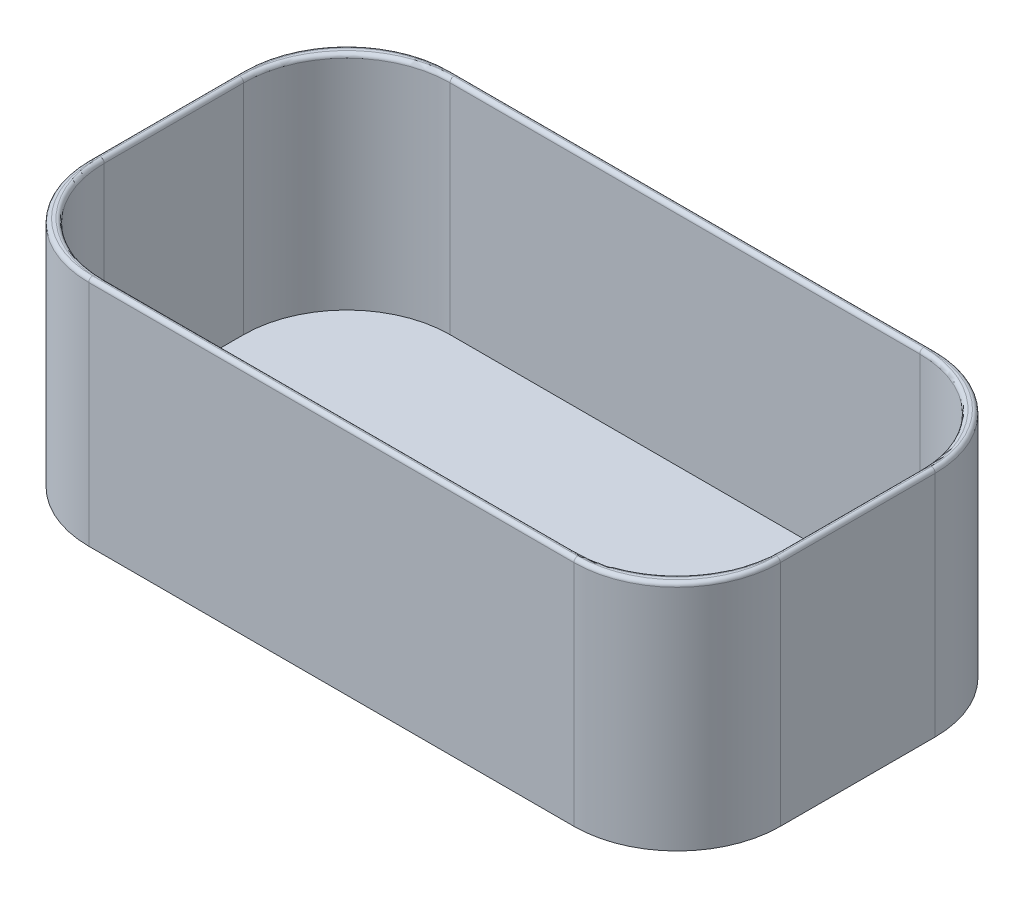
ISO-10303-21;
HEADER;
FILE_DESCRIPTION(('STEP AP214'),'2;1');
FILE_NAME('part.step','',(''),(''),'','','');
FILE_SCHEMA(('AUTOMOTIVE_DESIGN { 1 0 10303 214 1 1 1 1 }'));
ENDSEC;
DATA;
#1=APPLICATION_CONTEXT('core data for automotive mechanical design processes');
#2=APPLICATION_PROTOCOL_DEFINITION('international standard','automotive_design',2000,#1);
#3=PRODUCT_CONTEXT('',#1,'mechanical');
#4=PRODUCT('Part','Part','',(#3));
#5=PRODUCT_RELATED_PRODUCT_CATEGORY('part','',(#4));
#6=PRODUCT_DEFINITION_FORMATION('','',#4);
#7=PRODUCT_DEFINITION_CONTEXT('part definition',#1,'design');
#8=PRODUCT_DEFINITION('design','',#6,#7);
#9=PRODUCT_DEFINITION_SHAPE('','',#8);
#10=(LENGTH_UNIT() NAMED_UNIT(*) SI_UNIT(.MILLI.,.METRE.));
#11=(NAMED_UNIT(*) PLANE_ANGLE_UNIT() SI_UNIT($,.RADIAN.));
#12=(NAMED_UNIT(*) SI_UNIT($,.STERADIAN.) SOLID_ANGLE_UNIT());
#13=UNCERTAINTY_MEASURE_WITH_UNIT(LENGTH_MEASURE(1.E-05),#10,'distance_accuracy_value','');
#14=(GEOMETRIC_REPRESENTATION_CONTEXT(3) GLOBAL_UNCERTAINTY_ASSIGNED_CONTEXT((#13)) GLOBAL_UNIT_ASSIGNED_CONTEXT((#10,
#11,#12)) REPRESENTATION_CONTEXT('',''));
#15=CARTESIAN_POINT('',(0.,0.,0.));
#16=DIRECTION('',(0.,0.,1.));
#17=DIRECTION('',(1.,0.,0.));
#18=AXIS2_PLACEMENT_3D('',#15,#16,#17);
#19=CARTESIAN_POINT('',(0.,45.,0.));
#20=DIRECTION('',(0.,-1.,0.));
#21=DIRECTION('',(0.,0.,-1.));
#22=AXIS2_PLACEMENT_3D('',#19,#20,#21);
#23=PLANE('',#22);
#24=CARTESIAN_POINT('',(47.,45.,15.));
#25=DIRECTION('',(0.,-1.,0.));
#26=DIRECTION('',(0.,0.,-1.));
#27=AXIS2_PLACEMENT_3D('',#24,#25,#26);
#28=CIRCLE('',#27,19.25);
#29=CARTESIAN_POINT('',(47.,45.,34.25));
#30=VERTEX_POINT('',#29);
#31=CARTESIAN_POINT('',(66.25,45.,15.));
#32=VERTEX_POINT('',#31);
#33=EDGE_CURVE('E302',#30,#32,#28,.F.);
#34=ORIENTED_EDGE('',*,*,#33,.T.);
#35=DIRECTION('',(0.,0.,-1.));
#36=VECTOR('',#35,1.);
#37=CARTESIAN_POINT('',(66.25,45.,0.));
#38=LINE('',#37,#36);
#39=CARTESIAN_POINT('',(66.25,45.,13.5));
#40=VERTEX_POINT('',#39);
#41=EDGE_CURVE('E304',#32,#40,#38,.T.);
#42=ORIENTED_EDGE('',*,*,#41,.T.);
#43=CARTESIAN_POINT('',(45.5,45.,13.5));
#44=DIRECTION('',(0.,-1.,0.));
#45=DIRECTION('',(0.,0.,-1.));
#46=AXIS2_PLACEMENT_3D('',#43,#44,#45);
#47=CIRCLE('',#46,20.75);
#48=CARTESIAN_POINT('',(45.5,45.,34.25));
#49=VERTEX_POINT('',#48);
#50=EDGE_CURVE('E298',#40,#49,#47,.T.);
#51=ORIENTED_EDGE('',*,*,#50,.T.);
#52=DIRECTION('',(1.,0.,0.));
#53=VECTOR('',#52,1.);
#54=CARTESIAN_POINT('',(0.,45.,34.25));
#55=LINE('',#54,#53);
#56=EDGE_CURVE('E300',#49,#30,#55,.T.);
#57=ORIENTED_EDGE('',*,*,#56,.T.);
#58=EDGE_LOOP('',(#34,#42,#51,#57));
#59=FACE_BOUND('',#58,.T.);
#60=ADVANCED_FACE('F37',(#59),#23,.F.);
#61=CARTESIAN_POINT('',(47.,45.,-15.));
#62=DIRECTION('',(0.,-1.,0.));
#63=DIRECTION('',(0.,0.,-1.));
#64=AXIS2_PLACEMENT_3D('',#61,#62,#63);
#65=CIRCLE('',#64,19.25);
#66=CARTESIAN_POINT('',(66.25,45.,-15.));
#67=VERTEX_POINT('',#66);
#68=CARTESIAN_POINT('',(47.,45.,-34.25));
#69=VERTEX_POINT('',#68);
#70=EDGE_CURVE('E293',#67,#69,#65,.F.);
#71=ORIENTED_EDGE('',*,*,#70,.T.);
#72=DIRECTION('',(1.,0.,0.));
#73=VECTOR('',#72,1.);
#74=CARTESIAN_POINT('',(-47.,45.,-34.25));
#75=LINE('',#74,#73);
#76=CARTESIAN_POINT('',(45.5,45.,-34.25));
#77=VERTEX_POINT('',#76);
#78=EDGE_CURVE('E295',#69,#77,#75,.F.);
#79=ORIENTED_EDGE('',*,*,#78,.T.);
#80=CARTESIAN_POINT('',(45.5,45.,-13.5));
#81=DIRECTION('',(0.,-1.,0.));
#82=DIRECTION('',(0.,0.,-1.));
#83=AXIS2_PLACEMENT_3D('',#80,#81,#82);
#84=CIRCLE('',#83,20.75);
#85=CARTESIAN_POINT('',(66.25,45.,-13.5));
#86=VERTEX_POINT('',#85);
#87=EDGE_CURVE('E289',#77,#86,#84,.T.);
#88=ORIENTED_EDGE('',*,*,#87,.T.);
#89=DIRECTION('',(0.,0.,-1.));
#90=VECTOR('',#89,1.);
#91=CARTESIAN_POINT('',(66.25,45.,0.));
#92=LINE('',#91,#90);
#93=EDGE_CURVE('E291',#86,#67,#92,.T.);
#94=ORIENTED_EDGE('',*,*,#93,.T.);
#95=EDGE_LOOP('',(#71,#79,#88,#94));
#96=FACE_BOUND('',#95,.T.);
#97=ADVANCED_FACE('F481',(#96),#23,.F.);
#98=DIRECTION('',(1.,0.,0.));
#99=VECTOR('',#98,1.);
#100=CARTESIAN_POINT('',(-47.,45.,-34.25));
#101=LINE('',#100,#99);
#102=CARTESIAN_POINT('',(-45.5,45.,-34.25));
#103=VERTEX_POINT('',#102);
#104=CARTESIAN_POINT('',(-47.,45.,-34.25));
#105=VERTEX_POINT('',#104);
#106=EDGE_CURVE('E284',#103,#105,#101,.F.);
#107=ORIENTED_EDGE('',*,*,#106,.T.);
#108=CARTESIAN_POINT('',(-47.,45.,-15.));
#109=DIRECTION('',(0.,-1.,0.));
#110=DIRECTION('',(0.,0.,-1.));
#111=AXIS2_PLACEMENT_3D('',#108,#109,#110);
#112=CIRCLE('',#111,19.25);
#113=CARTESIAN_POINT('',(-66.25,45.,-15.));
#114=VERTEX_POINT('',#113);
#115=EDGE_CURVE('E286',#105,#114,#112,.F.);
#116=ORIENTED_EDGE('',*,*,#115,.T.);
#117=DIRECTION('',(0.,0.,-1.));
#118=VECTOR('',#117,1.);
#119=CARTESIAN_POINT('',(-66.25,45.,15.));
#120=LINE('',#119,#118);
#121=CARTESIAN_POINT('',(-66.25,45.,-13.5));
#122=VERTEX_POINT('',#121);
#123=EDGE_CURVE('E282',#114,#122,#120,.F.);
#124=ORIENTED_EDGE('',*,*,#123,.T.);
#125=CARTESIAN_POINT('',(-45.5,45.,-13.5));
#126=DIRECTION('',(0.,-1.,0.));
#127=DIRECTION('',(0.,0.,-1.));
#128=AXIS2_PLACEMENT_3D('',#125,#126,#127);
#129=CIRCLE('',#128,20.75);
#130=EDGE_CURVE('E280',#122,#103,#129,.T.);
#131=ORIENTED_EDGE('',*,*,#130,.T.);
#132=EDGE_LOOP('',(#107,#116,#124,#131));
#133=FACE_BOUND('',#132,.T.);
#134=ADVANCED_FACE('F486',(#133),#23,.F.);
#135=CARTESIAN_POINT('',(-67.,45.,35.));
#136=DIRECTION('',(-1.,0.,0.));
#137=DIRECTION('',(0.,0.,1.));
#138=AXIS2_PLACEMENT_3D('',#135,#136,#137);
#139=PLANE('',#138);
#140=DIRECTION('',(0.,-1.,0.));
#141=VECTOR('',#140,1.);
#142=CARTESIAN_POINT('',(-67.,45.,15.));
#143=LINE('',#142,#141);
#144=CARTESIAN_POINT('',(-67.,0.,15.));
#145=VERTEX_POINT('',#144);
#146=CARTESIAN_POINT('',(-67.,44.25,15.));
#147=VERTEX_POINT('',#146);
#148=EDGE_CURVE('E248',#145,#147,#143,.F.);
#149=ORIENTED_EDGE('',*,*,#148,.T.);
#150=DIRECTION('',(0.,0.,-1.));
#151=VECTOR('',#150,1.);
#152=CARTESIAN_POINT('',(-67.,44.25,-15.));
#153=LINE('',#152,#151);
#154=CARTESIAN_POINT('',(-67.,44.25,-15.));
#155=VERTEX_POINT('',#154);
#156=EDGE_CURVE('E322',#147,#155,#153,.T.);
#157=ORIENTED_EDGE('',*,*,#156,.T.);
#158=DIRECTION('',(0.,-1.,0.));
#159=VECTOR('',#158,1.);
#160=CARTESIAN_POINT('',(-67.,45.,-15.));
#161=LINE('',#160,#159);
#162=CARTESIAN_POINT('',(-67.,0.,-15.));
#163=VERTEX_POINT('',#162);
#164=EDGE_CURVE('E246',#155,#163,#161,.T.);
#165=ORIENTED_EDGE('',*,*,#164,.T.);
#166=DIRECTION('',(0.,0.,-1.));
#167=VECTOR('',#166,1.);
#168=CARTESIAN_POINT('',(-67.,0.,35.));
#169=LINE('',#168,#167);
#170=EDGE_CURVE('E401',#145,#163,#169,.T.);
#171=ORIENTED_EDGE('',*,*,#170,.F.);
#172=EDGE_LOOP('',(#149,#157,#165,#171));
#173=FACE_BOUND('',#172,.T.);
#174=ADVANCED_FACE('F450',(#173),#139,.T.);
#175=CARTESIAN_POINT('',(-67.,45.,35.));
#176=DIRECTION('',(0.,0.,-1.));
#177=DIRECTION('',(-1.,0.,0.));
#178=AXIS2_PLACEMENT_3D('',#175,#176,#177);
#179=PLANE('',#178);
#180=DIRECTION('',(0.,-1.,0.));
#181=VECTOR('',#180,1.);
#182=CARTESIAN_POINT('',(47.,45.,35.));
#183=LINE('',#182,#181);
#184=CARTESIAN_POINT('',(47.,0.,35.));
#185=VERTEX_POINT('',#184);
#186=CARTESIAN_POINT('',(47.,44.25,35.));
#187=VERTEX_POINT('',#186);
#188=EDGE_CURVE('E208',#185,#187,#183,.F.);
#189=ORIENTED_EDGE('',*,*,#188,.T.);
#190=DIRECTION('',(1.,0.,0.));
#191=VECTOR('',#190,1.);
#192=CARTESIAN_POINT('',(-67.,44.25,35.));
#193=LINE('',#192,#191);
#194=CARTESIAN_POINT('',(-47.,44.25,35.));
#195=VERTEX_POINT('',#194);
#196=EDGE_CURVE('E318',#187,#195,#193,.F.);
#197=ORIENTED_EDGE('',*,*,#196,.T.);
#198=DIRECTION('',(0.,-1.,0.));
#199=VECTOR('',#198,1.);
#200=CARTESIAN_POINT('',(-47.,0.,35.));
#201=LINE('',#200,#199);
#202=CARTESIAN_POINT('',(-47.,0.,35.));
#203=VERTEX_POINT('',#202);
#204=EDGE_CURVE('E236',#195,#203,#201,.T.);
#205=ORIENTED_EDGE('',*,*,#204,.T.);
#206=DIRECTION('',(1.,0.,0.));
#207=VECTOR('',#206,1.);
#208=CARTESIAN_POINT('',(-67.,0.,35.));
#209=LINE('',#208,#207);
#210=EDGE_CURVE('E224',#203,#185,#209,.T.);
#211=ORIENTED_EDGE('',*,*,#210,.T.);
#212=EDGE_LOOP('',(#189,#197,#205,#211));
#213=FACE_BOUND('',#212,.T.);
#214=ADVANCED_FACE('F415',(#213),#179,.F.);
#215=CARTESIAN_POINT('',(67.,45.,35.));
#216=DIRECTION('',(-1.,0.,0.));
#217=DIRECTION('',(0.,0.,1.));
#218=AXIS2_PLACEMENT_3D('',#215,#216,#217);
#219=PLANE('',#218);
#220=DIRECTION('',(0.,-1.,0.));
#221=VECTOR('',#220,1.);
#222=CARTESIAN_POINT('',(67.,45.,-15.));
#223=LINE('',#222,#221);
#224=CARTESIAN_POINT('',(67.,0.,-15.));
#225=VERTEX_POINT('',#224);
#226=CARTESIAN_POINT('',(67.,44.25,-15.));
#227=VERTEX_POINT('',#226);
#228=EDGE_CURVE('E266',#225,#227,#223,.F.);
#229=ORIENTED_EDGE('',*,*,#228,.T.);
#230=DIRECTION('',(0.,0.,-1.));
#231=VECTOR('',#230,1.);
#232=CARTESIAN_POINT('',(67.,44.25,35.));
#233=LINE('',#232,#231);
#234=CARTESIAN_POINT('',(67.,44.25,15.));
#235=VERTEX_POINT('',#234);
#236=EDGE_CURVE('E314',#227,#235,#233,.F.);
#237=ORIENTED_EDGE('',*,*,#236,.T.);
#238=DIRECTION('',(0.,-1.,0.));
#239=VECTOR('',#238,1.);
#240=CARTESIAN_POINT('',(67.,45.,15.));
#241=LINE('',#240,#239);
#242=CARTESIAN_POINT('',(67.,0.,15.));
#243=VERTEX_POINT('',#242);
#244=EDGE_CURVE('E269',#235,#243,#241,.T.);
#245=ORIENTED_EDGE('',*,*,#244,.T.);
#246=DIRECTION('',(0.,0.,-1.));
#247=VECTOR('',#246,1.);
#248=CARTESIAN_POINT('',(67.,0.,35.));
#249=LINE('',#248,#247);
#250=EDGE_CURVE('E409',#243,#225,#249,.T.);
#251=ORIENTED_EDGE('',*,*,#250,.T.);
#252=EDGE_LOOP('',(#229,#237,#245,#251));
#253=FACE_BOUND('',#252,.T.);
#254=ADVANCED_FACE('F470',(#253),#219,.F.);
#255=CARTESIAN_POINT('',(-67.,45.,-35.));
#256=DIRECTION('',(0.,0.,-1.));
#257=DIRECTION('',(-1.,0.,0.));
#258=AXIS2_PLACEMENT_3D('',#255,#256,#257);
#259=PLANE('',#258);
#260=DIRECTION('',(0.,-1.,0.));
#261=VECTOR('',#260,1.);
#262=CARTESIAN_POINT('',(-47.,45.,-35.));
#263=LINE('',#262,#261);
#264=CARTESIAN_POINT('',(-47.,0.,-35.));
#265=VERTEX_POINT('',#264);
#266=CARTESIAN_POINT('',(-47.,44.25,-35.));
#267=VERTEX_POINT('',#266);
#268=EDGE_CURVE('E253',#265,#267,#263,.F.);
#269=ORIENTED_EDGE('',*,*,#268,.T.);
#270=DIRECTION('',(1.,0.,0.));
#271=VECTOR('',#270,1.);
#272=CARTESIAN_POINT('',(47.,44.25,-35.));
#273=LINE('',#272,#271);
#274=CARTESIAN_POINT('',(47.,44.25,-35.));
#275=VERTEX_POINT('',#274);
#276=EDGE_CURVE('E310',#267,#275,#273,.T.);
#277=ORIENTED_EDGE('',*,*,#276,.T.);
#278=DIRECTION('',(0.,-1.,0.));
#279=VECTOR('',#278,1.);
#280=CARTESIAN_POINT('',(47.,0.,-35.));
#281=LINE('',#280,#279);
#282=CARTESIAN_POINT('',(47.,0.,-35.));
#283=VERTEX_POINT('',#282);
#284=EDGE_CURVE('E251',#275,#283,#281,.T.);
#285=ORIENTED_EDGE('',*,*,#284,.T.);
#286=DIRECTION('',(1.,0.,0.));
#287=VECTOR('',#286,1.);
#288=CARTESIAN_POINT('',(-67.,0.,-35.));
#289=LINE('',#288,#287);
#290=EDGE_CURVE('E406',#265,#283,#289,.T.);
#291=ORIENTED_EDGE('',*,*,#290,.F.);
#292=EDGE_LOOP('',(#269,#277,#285,#291));
#293=FACE_BOUND('',#292,.T.);
#294=ADVANCED_FACE('F461',(#293),#259,.T.);
#295=CARTESIAN_POINT('',(-47.,45.,15.));
#296=DIRECTION('',(0.,-1.,0.));
#297=DIRECTION('',(0.,0.,-1.));
#298=AXIS2_PLACEMENT_3D('',#295,#296,#297);
#299=CIRCLE('',#298,19.25);
#300=CARTESIAN_POINT('',(-66.25,45.,15.));
#301=VERTEX_POINT('',#300);
#302=CARTESIAN_POINT('',(-47.,45.,34.25));
#303=VERTEX_POINT('',#302);
#304=EDGE_CURVE('E275',#301,#303,#299,.F.);
#305=ORIENTED_EDGE('',*,*,#304,.T.);
#306=DIRECTION('',(1.,0.,0.));
#307=VECTOR('',#306,1.);
#308=CARTESIAN_POINT('',(0.,45.,34.25));
#309=LINE('',#308,#307);
#310=CARTESIAN_POINT('',(-45.5,45.,34.25));
#311=VERTEX_POINT('',#310);
#312=EDGE_CURVE('E277',#303,#311,#309,.T.);
#313=ORIENTED_EDGE('',*,*,#312,.T.);
#314=CARTESIAN_POINT('',(-45.5,45.,13.5));
#315=DIRECTION('',(0.,-1.,0.));
#316=DIRECTION('',(0.,0.,-1.));
#317=AXIS2_PLACEMENT_3D('',#314,#315,#316);
#318=CIRCLE('',#317,20.75);
#319=CARTESIAN_POINT('',(-66.25,45.,13.5));
#320=VERTEX_POINT('',#319);
#321=EDGE_CURVE('E271',#311,#320,#318,.T.);
#322=ORIENTED_EDGE('',*,*,#321,.T.);
#323=DIRECTION('',(0.,0.,-1.));
#324=VECTOR('',#323,1.);
#325=CARTESIAN_POINT('',(-66.25,45.,15.));
#326=LINE('',#325,#324);
#327=EDGE_CURVE('E273',#320,#301,#326,.F.);
#328=ORIENTED_EDGE('',*,*,#327,.T.);
#329=EDGE_LOOP('',(#305,#313,#322,#328));
#330=FACE_BOUND('',#329,.T.);
#331=ADVANCED_FACE('F477',(#330),#23,.F.);
#332=CARTESIAN_POINT('',(0.,0.,0.));
#333=DIRECTION('',(0.,-1.,0.));
#334=DIRECTION('',(0.,0.,-1.));
#335=AXIS2_PLACEMENT_3D('',#332,#333,#334);
#336=PLANE('',#335);
#337=ORIENTED_EDGE('',*,*,#210,.F.);
#338=CARTESIAN_POINT('',(-47.,0.,15.));
#339=DIRECTION('',(0.,-1.,0.));
#340=DIRECTION('',(0.,0.,-1.));
#341=AXIS2_PLACEMENT_3D('',#338,#339,#340);
#342=CIRCLE('',#341,20.);
#343=EDGE_CURVE('E244',#203,#145,#342,.T.);
#344=ORIENTED_EDGE('',*,*,#343,.T.);
#345=ORIENTED_EDGE('',*,*,#170,.T.);
#346=CARTESIAN_POINT('',(-47.,0.,-15.));
#347=DIRECTION('',(0.,-1.,0.));
#348=DIRECTION('',(0.,0.,-1.));
#349=AXIS2_PLACEMENT_3D('',#346,#347,#348);
#350=CIRCLE('',#349,20.);
#351=EDGE_CURVE('E242',#163,#265,#350,.T.);
#352=ORIENTED_EDGE('',*,*,#351,.T.);
#353=ORIENTED_EDGE('',*,*,#290,.T.);
#354=CARTESIAN_POINT('',(47.,0.,-15.));
#355=DIRECTION('',(0.,-1.,0.));
#356=DIRECTION('',(0.,0.,-1.));
#357=AXIS2_PLACEMENT_3D('',#354,#355,#356);
#358=CIRCLE('',#357,20.);
#359=EDGE_CURVE('E238',#283,#225,#358,.T.);
#360=ORIENTED_EDGE('',*,*,#359,.T.);
#361=ORIENTED_EDGE('',*,*,#250,.F.);
#362=CARTESIAN_POINT('',(47.,0.,15.));
#363=DIRECTION('',(0.,-1.,0.));
#364=DIRECTION('',(0.,0.,-1.));
#365=AXIS2_PLACEMENT_3D('',#362,#363,#364);
#366=CIRCLE('',#365,20.);
#367=EDGE_CURVE('E240',#243,#185,#366,.T.);
#368=ORIENTED_EDGE('',*,*,#367,.T.);
#369=EDGE_LOOP('',(#337,#344,#345,#352,#353,#360,#361,#368));
#370=FACE_BOUND('',#369,.T.);
#371=ADVANCED_FACE('F448',(#370),#336,.T.);
#372=CARTESIAN_POINT('',(0.,2.,0.));
#373=DIRECTION('',(0.,-1.,0.));
#374=DIRECTION('',(0.,0.,-1.));
#375=AXIS2_PLACEMENT_3D('',#372,#373,#374);
#376=PLANE('',#375);
#377=DIRECTION('',(0.,0.,1.));
#378=VECTOR('',#377,1.);
#379=CARTESIAN_POINT('',(-65.5,2.,-33.5));
#380=LINE('',#379,#378);
#381=CARTESIAN_POINT('',(-65.5,2.,-13.5));
#382=VERTEX_POINT('',#381);
#383=CARTESIAN_POINT('',(-65.5,2.,13.5));
#384=VERTEX_POINT('',#383);
#385=EDGE_CURVE('E207',#382,#384,#380,.T.);
#386=ORIENTED_EDGE('',*,*,#385,.T.);
#387=CARTESIAN_POINT('',(-45.5,2.,13.5));
#388=DIRECTION('',(0.,-1.,0.));
#389=DIRECTION('',(0.,0.,-1.));
#390=AXIS2_PLACEMENT_3D('',#387,#388,#389);
#391=CIRCLE('',#390,20.);
#392=CARTESIAN_POINT('',(-45.5,2.,33.5));
#393=VERTEX_POINT('',#392);
#394=EDGE_CURVE('E201',#384,#393,#391,.F.);
#395=ORIENTED_EDGE('',*,*,#394,.T.);
#396=DIRECTION('',(1.,0.,0.));
#397=VECTOR('',#396,1.);
#398=CARTESIAN_POINT('',(-65.5,2.,33.5));
#399=LINE('',#398,#397);
#400=CARTESIAN_POINT('',(45.5,2.,33.5));
#401=VERTEX_POINT('',#400);
#402=EDGE_CURVE('E204',#393,#401,#399,.T.);
#403=ORIENTED_EDGE('',*,*,#402,.T.);
#404=CARTESIAN_POINT('',(45.5,2.,13.5));
#405=DIRECTION('',(0.,-1.,0.));
#406=DIRECTION('',(0.,0.,-1.));
#407=AXIS2_PLACEMENT_3D('',#404,#405,#406);
#408=CIRCLE('',#407,20.);
#409=CARTESIAN_POINT('',(65.5,2.,13.5));
#410=VERTEX_POINT('',#409);
#411=EDGE_CURVE('E229',#401,#410,#408,.F.);
#412=ORIENTED_EDGE('',*,*,#411,.T.);
#413=DIRECTION('',(0.,0.,-1.));
#414=VECTOR('',#413,1.);
#415=CARTESIAN_POINT('',(65.5,2.,33.5));
#416=LINE('',#415,#414);
#417=CARTESIAN_POINT('',(65.5,2.,-13.5));
#418=VERTEX_POINT('',#417);
#419=EDGE_CURVE('E217',#410,#418,#416,.T.);
#420=ORIENTED_EDGE('',*,*,#419,.T.);
#421=CARTESIAN_POINT('',(45.5,2.,-13.5));
#422=DIRECTION('',(0.,-1.,0.));
#423=DIRECTION('',(0.,0.,-1.));
#424=AXIS2_PLACEMENT_3D('',#421,#422,#423);
#425=CIRCLE('',#424,20.);
#426=CARTESIAN_POINT('',(45.5,2.,-33.5));
#427=VERTEX_POINT('',#426);
#428=EDGE_CURVE('E231',#418,#427,#425,.F.);
#429=ORIENTED_EDGE('',*,*,#428,.T.);
#430=DIRECTION('',(-1.,0.,0.));
#431=VECTOR('',#430,1.);
#432=CARTESIAN_POINT('',(65.5,2.,-33.5));
#433=LINE('',#432,#431);
#434=CARTESIAN_POINT('',(-45.5,2.,-33.5));
#435=VERTEX_POINT('',#434);
#436=EDGE_CURVE('E398',#427,#435,#433,.T.);
#437=ORIENTED_EDGE('',*,*,#436,.T.);
#438=CARTESIAN_POINT('',(-45.5,2.,-13.5));
#439=DIRECTION('',(0.,-1.,0.));
#440=DIRECTION('',(0.,0.,-1.));
#441=AXIS2_PLACEMENT_3D('',#438,#439,#440);
#442=CIRCLE('',#441,20.);
#443=EDGE_CURVE('E209',#435,#382,#442,.F.);
#444=ORIENTED_EDGE('',*,*,#443,.T.);
#445=EDGE_LOOP('',(#386,#395,#403,#412,#420,#429,#437,#444));
#446=FACE_BOUND('',#445,.T.);
#447=ADVANCED_FACE('F203',(#446),#376,.F.);
#448=CARTESIAN_POINT('',(-65.5,-147.139389695622,-33.5));
#449=DIRECTION('',(-1.,0.,0.));
#450=DIRECTION('',(0.,0.,1.));
#451=AXIS2_PLACEMENT_3D('',#448,#449,#450);
#452=PLANE('',#451);
#453=DIRECTION('',(0.,1.,0.));
#454=VECTOR('',#453,1.);
#455=CARTESIAN_POINT('',(-65.5,45.,-13.5));
#456=LINE('',#455,#454);
#457=CARTESIAN_POINT('',(-65.5,44.25,-13.5));
#458=VERTEX_POINT('',#457);
#459=EDGE_CURVE('E220',#382,#458,#456,.T.);
#460=ORIENTED_EDGE('',*,*,#459,.T.);
#461=DIRECTION('',(0.,0.,1.));
#462=VECTOR('',#461,1.);
#463=CARTESIAN_POINT('',(-65.5,44.25,-33.5));
#464=LINE('',#463,#462);
#465=CARTESIAN_POINT('',(-65.5,44.25,13.5));
#466=VERTEX_POINT('',#465);
#467=EDGE_CURVE('E61',#458,#466,#464,.T.);
#468=ORIENTED_EDGE('',*,*,#467,.T.);
#469=DIRECTION('',(0.,1.,0.));
#470=VECTOR('',#469,1.);
#471=CARTESIAN_POINT('',(-65.5,1.99999999999995,13.5));
#472=LINE('',#471,#470);
#473=EDGE_CURVE('E222',#466,#384,#472,.F.);
#474=ORIENTED_EDGE('',*,*,#473,.T.);
#475=ORIENTED_EDGE('',*,*,#385,.F.);
#476=EDGE_LOOP('',(#460,#468,#474,#475));
#477=FACE_BOUND('',#476,.T.);
#478=ADVANCED_FACE('F598',(#477),#452,.F.);
#479=CARTESIAN_POINT('',(-65.5,-147.139389695622,33.5));
#480=DIRECTION('',(0.,0.,1.));
#481=DIRECTION('',(1.,0.,0.));
#482=AXIS2_PLACEMENT_3D('',#479,#480,#481);
#483=PLANE('',#482);
#484=DIRECTION('',(0.,1.,0.));
#485=VECTOR('',#484,1.);
#486=CARTESIAN_POINT('',(-45.5,45.,33.5));
#487=LINE('',#486,#485);
#488=CARTESIAN_POINT('',(-45.5,44.25,33.5));
#489=VERTEX_POINT('',#488);
#490=EDGE_CURVE('E213',#393,#489,#487,.T.);
#491=ORIENTED_EDGE('',*,*,#490,.T.);
#492=DIRECTION('',(1.,0.,0.));
#493=VECTOR('',#492,1.);
#494=CARTESIAN_POINT('',(-65.5,44.25,33.5));
#495=LINE('',#494,#493);
#496=CARTESIAN_POINT('',(45.5,44.25,33.5));
#497=VERTEX_POINT('',#496);
#498=EDGE_CURVE('E12',#489,#497,#495,.T.);
#499=ORIENTED_EDGE('',*,*,#498,.T.);
#500=DIRECTION('',(0.,1.,0.));
#501=VECTOR('',#500,1.);
#502=CARTESIAN_POINT('',(45.5,2.,33.5));
#503=LINE('',#502,#501);
#504=EDGE_CURVE('E216',#497,#401,#503,.F.);
#505=ORIENTED_EDGE('',*,*,#504,.T.);
#506=ORIENTED_EDGE('',*,*,#402,.F.);
#507=EDGE_LOOP('',(#491,#499,#505,#506));
#508=FACE_BOUND('',#507,.T.);
#509=ADVANCED_FACE('F212',(#508),#483,.F.);
#510=CARTESIAN_POINT('',(65.5,-147.139389695622,33.5));
#511=DIRECTION('',(1.,0.,0.));
#512=DIRECTION('',(0.,0.,-1.));
#513=AXIS2_PLACEMENT_3D('',#510,#511,#512);
#514=PLANE('',#513);
#515=DIRECTION('',(0.,1.,0.));
#516=VECTOR('',#515,1.);
#517=CARTESIAN_POINT('',(65.5,45.,13.5));
#518=LINE('',#517,#516);
#519=CARTESIAN_POINT('',(65.5,44.25,13.5));
#520=VERTEX_POINT('',#519);
#521=EDGE_CURVE('E261',#410,#520,#518,.T.);
#522=ORIENTED_EDGE('',*,*,#521,.T.);
#523=DIRECTION('',(0.,0.,-1.));
#524=VECTOR('',#523,1.);
#525=CARTESIAN_POINT('',(65.5,44.25,33.5));
#526=LINE('',#525,#524);
#527=CARTESIAN_POINT('',(65.5,44.25,-13.5));
#528=VERTEX_POINT('',#527);
#529=EDGE_CURVE('E327',#520,#528,#526,.T.);
#530=ORIENTED_EDGE('',*,*,#529,.T.);
#531=DIRECTION('',(0.,1.,0.));
#532=VECTOR('',#531,1.);
#533=CARTESIAN_POINT('',(65.5,2.,-13.5));
#534=LINE('',#533,#532);
#535=EDGE_CURVE('E264',#528,#418,#534,.F.);
#536=ORIENTED_EDGE('',*,*,#535,.T.);
#537=ORIENTED_EDGE('',*,*,#419,.F.);
#538=EDGE_LOOP('',(#522,#530,#536,#537));
#539=FACE_BOUND('',#538,.T.);
#540=ADVANCED_FACE('F579',(#539),#514,.F.);
#541=CARTESIAN_POINT('',(65.5,-147.139389695622,-33.5));
#542=DIRECTION('',(0.,0.,-1.));
#543=DIRECTION('',(-1.,0.,0.));
#544=AXIS2_PLACEMENT_3D('',#541,#542,#543);
#545=PLANE('',#544);
#546=DIRECTION('',(0.,1.,0.));
#547=VECTOR('',#546,1.);
#548=CARTESIAN_POINT('',(45.5,45.,-33.5));
#549=LINE('',#548,#547);
#550=CARTESIAN_POINT('',(45.5,44.25,-33.5));
#551=VERTEX_POINT('',#550);
#552=EDGE_CURVE('E256',#427,#551,#549,.T.);
#553=ORIENTED_EDGE('',*,*,#552,.T.);
#554=DIRECTION('',(-1.,0.,0.));
#555=VECTOR('',#554,1.);
#556=CARTESIAN_POINT('',(65.5,44.25,-33.5));
#557=LINE('',#556,#555);
#558=CARTESIAN_POINT('',(-45.5,44.25,-33.5));
#559=VERTEX_POINT('',#558);
#560=EDGE_CURVE('E331',#551,#559,#557,.T.);
#561=ORIENTED_EDGE('',*,*,#560,.T.);
#562=DIRECTION('',(0.,1.,0.));
#563=VECTOR('',#562,1.);
#564=CARTESIAN_POINT('',(-45.5,2.,-33.5));
#565=LINE('',#564,#563);
#566=EDGE_CURVE('E259',#559,#435,#565,.F.);
#567=ORIENTED_EDGE('',*,*,#566,.T.);
#568=ORIENTED_EDGE('',*,*,#436,.F.);
#569=EDGE_LOOP('',(#553,#561,#567,#568));
#570=FACE_BOUND('',#569,.T.);
#571=ADVANCED_FACE('F587',(#570),#545,.F.);
#572=CARTESIAN_POINT('',(-45.5,-147.139389695622,13.5));
#573=DIRECTION('',(0.,-1.,0.));
#574=DIRECTION('',(0.,0.,-1.));
#575=AXIS2_PLACEMENT_3D('',#572,#573,#574);
#576=CYLINDRICAL_SURFACE('',#575,20.);
#577=ORIENTED_EDGE('',*,*,#473,.F.);
#578=CARTESIAN_POINT('',(-45.5,44.25,13.5));
#579=DIRECTION('',(0.,-1.,0.));
#580=DIRECTION('',(0.,0.,-1.));
#581=AXIS2_PLACEMENT_3D('',#578,#579,#580);
#582=CIRCLE('',#581,20.);
#583=EDGE_CURVE('E46',#466,#489,#582,.F.);
#584=ORIENTED_EDGE('',*,*,#583,.T.);
#585=ORIENTED_EDGE('',*,*,#490,.F.);
#586=ORIENTED_EDGE('',*,*,#394,.F.);
#587=EDGE_LOOP('',(#577,#584,#585,#586));
#588=FACE_BOUND('',#587,.T.);
#589=ADVANCED_FACE('F219',(#588),#576,.F.);
#590=CARTESIAN_POINT('',(-47.,45.,15.));
#591=DIRECTION('',(0.,1.,0.));
#592=DIRECTION('',(0.,0.,1.));
#593=AXIS2_PLACEMENT_3D('',#590,#591,#592);
#594=CYLINDRICAL_SURFACE('',#593,20.);
#595=ORIENTED_EDGE('',*,*,#204,.F.);
#596=CARTESIAN_POINT('',(-47.,44.25,15.));
#597=DIRECTION('',(0.,-1.,0.));
#598=DIRECTION('',(0.,0.,-1.));
#599=AXIS2_PLACEMENT_3D('',#596,#597,#598);
#600=CIRCLE('',#599,20.);
#601=EDGE_CURVE('E320',#195,#147,#600,.T.);
#602=ORIENTED_EDGE('',*,*,#601,.T.);
#603=ORIENTED_EDGE('',*,*,#148,.F.);
#604=ORIENTED_EDGE('',*,*,#343,.F.);
#605=EDGE_LOOP('',(#595,#602,#603,#604));
#606=FACE_BOUND('',#605,.T.);
#607=ADVANCED_FACE('F445',(#606),#594,.T.);
#608=CARTESIAN_POINT('',(-47.,45.,-15.));
#609=DIRECTION('',(0.,-1.,0.));
#610=DIRECTION('',(0.,0.,-1.));
#611=AXIS2_PLACEMENT_3D('',#608,#609,#610);
#612=CYLINDRICAL_SURFACE('',#611,20.);
#613=ORIENTED_EDGE('',*,*,#164,.F.);
#614=CARTESIAN_POINT('',(-47.,44.25,-15.));
#615=DIRECTION('',(0.,-1.,0.));
#616=DIRECTION('',(0.,0.,-1.));
#617=AXIS2_PLACEMENT_3D('',#614,#615,#616);
#618=CIRCLE('',#617,20.);
#619=EDGE_CURVE('E307',#155,#267,#618,.T.);
#620=ORIENTED_EDGE('',*,*,#619,.T.);
#621=ORIENTED_EDGE('',*,*,#268,.F.);
#622=ORIENTED_EDGE('',*,*,#351,.F.);
#623=EDGE_LOOP('',(#613,#620,#621,#622));
#624=FACE_BOUND('',#623,.T.);
#625=ADVANCED_FACE('F458',(#624),#612,.T.);
#626=CARTESIAN_POINT('',(-45.5,-147.139389695622,-13.5));
#627=DIRECTION('',(0.,-1.,0.));
#628=DIRECTION('',(0.,0.,-1.));
#629=AXIS2_PLACEMENT_3D('',#626,#627,#628);
#630=CYLINDRICAL_SURFACE('',#629,20.);
#631=ORIENTED_EDGE('',*,*,#566,.F.);
#632=CARTESIAN_POINT('',(-45.5,44.25,-13.5));
#633=DIRECTION('',(0.,-1.,0.));
#634=DIRECTION('',(0.,0.,-1.));
#635=AXIS2_PLACEMENT_3D('',#632,#633,#634);
#636=CIRCLE('',#635,20.);
#637=EDGE_CURVE('E333',#559,#458,#636,.F.);
#638=ORIENTED_EDGE('',*,*,#637,.T.);
#639=ORIENTED_EDGE('',*,*,#459,.F.);
#640=ORIENTED_EDGE('',*,*,#443,.F.);
#641=EDGE_LOOP('',(#631,#638,#639,#640));
#642=FACE_BOUND('',#641,.T.);
#643=ADVANCED_FACE('F597',(#642),#630,.F.);
#644=CARTESIAN_POINT('',(45.5,-147.139389695622,-13.5));
#645=DIRECTION('',(0.,-1.,0.));
#646=DIRECTION('',(0.,0.,-1.));
#647=AXIS2_PLACEMENT_3D('',#644,#645,#646);
#648=CYLINDRICAL_SURFACE('',#647,20.);
#649=ORIENTED_EDGE('',*,*,#535,.F.);
#650=CARTESIAN_POINT('',(45.5,44.25,-13.5));
#651=DIRECTION('',(0.,-1.,0.));
#652=DIRECTION('',(0.,0.,-1.));
#653=AXIS2_PLACEMENT_3D('',#650,#651,#652);
#654=CIRCLE('',#653,20.);
#655=EDGE_CURVE('E329',#528,#551,#654,.F.);
#656=ORIENTED_EDGE('',*,*,#655,.T.);
#657=ORIENTED_EDGE('',*,*,#552,.F.);
#658=ORIENTED_EDGE('',*,*,#428,.F.);
#659=EDGE_LOOP('',(#649,#656,#657,#658));
#660=FACE_BOUND('',#659,.T.);
#661=ADVANCED_FACE('F584',(#660),#648,.F.);
#662=CARTESIAN_POINT('',(45.5,-147.139389695622,13.5));
#663=DIRECTION('',(0.,-1.,0.));
#664=DIRECTION('',(0.,0.,-1.));
#665=AXIS2_PLACEMENT_3D('',#662,#663,#664);
#666=CYLINDRICAL_SURFACE('',#665,20.);
#667=ORIENTED_EDGE('',*,*,#504,.F.);
#668=CARTESIAN_POINT('',(45.5,44.25,13.5));
#669=DIRECTION('',(0.,-1.,0.));
#670=DIRECTION('',(0.,0.,-1.));
#671=AXIS2_PLACEMENT_3D('',#668,#669,#670);
#672=CIRCLE('',#671,20.);
#673=EDGE_CURVE('E324',#497,#520,#672,.F.);
#674=ORIENTED_EDGE('',*,*,#673,.T.);
#675=ORIENTED_EDGE('',*,*,#521,.F.);
#676=ORIENTED_EDGE('',*,*,#411,.F.);
#677=EDGE_LOOP('',(#667,#674,#675,#676));
#678=FACE_BOUND('',#677,.T.);
#679=ADVANCED_FACE('F577',(#678),#666,.F.);
#680=CARTESIAN_POINT('',(47.,45.,15.));
#681=DIRECTION('',(0.,-1.,0.));
#682=DIRECTION('',(0.,0.,-1.));
#683=AXIS2_PLACEMENT_3D('',#680,#681,#682);
#684=CYLINDRICAL_SURFACE('',#683,20.);
#685=ORIENTED_EDGE('',*,*,#244,.F.);
#686=CARTESIAN_POINT('',(47.,44.25,15.));
#687=DIRECTION('',(0.,-1.,0.));
#688=DIRECTION('',(0.,0.,-1.));
#689=AXIS2_PLACEMENT_3D('',#686,#687,#688);
#690=CIRCLE('',#689,20.);
#691=EDGE_CURVE('E316',#235,#187,#690,.T.);
#692=ORIENTED_EDGE('',*,*,#691,.T.);
#693=ORIENTED_EDGE('',*,*,#188,.F.);
#694=ORIENTED_EDGE('',*,*,#367,.F.);
#695=EDGE_LOOP('',(#685,#692,#693,#694));
#696=FACE_BOUND('',#695,.T.);
#697=ADVANCED_FACE('F423',(#696),#684,.T.);
#698=CARTESIAN_POINT('',(47.,45.,-15.));
#699=DIRECTION('',(0.,1.,0.));
#700=DIRECTION('',(0.,0.,1.));
#701=AXIS2_PLACEMENT_3D('',#698,#699,#700);
#702=CYLINDRICAL_SURFACE('',#701,20.);
#703=ORIENTED_EDGE('',*,*,#284,.F.);
#704=CARTESIAN_POINT('',(47.,44.25,-15.));
#705=DIRECTION('',(0.,-1.,0.));
#706=DIRECTION('',(0.,0.,-1.));
#707=AXIS2_PLACEMENT_3D('',#704,#705,#706);
#708=CIRCLE('',#707,20.);
#709=EDGE_CURVE('E312',#275,#227,#708,.T.);
#710=ORIENTED_EDGE('',*,*,#709,.T.);
#711=ORIENTED_EDGE('',*,*,#228,.F.);
#712=ORIENTED_EDGE('',*,*,#359,.F.);
#713=EDGE_LOOP('',(#703,#710,#711,#712));
#714=FACE_BOUND('',#713,.T.);
#715=ADVANCED_FACE('F468',(#714),#702,.T.);
#716=CARTESIAN_POINT('',(45.5,44.25,13.5));
#717=DIRECTION('',(0.,-1.,0.));
#718=DIRECTION('',(0.,0.,-1.));
#719=AXIS2_PLACEMENT_3D('',#716,#717,#718);
#720=TOROIDAL_SURFACE('',#719,20.75,0.75);
#721=CARTESIAN_POINT('',(66.25,44.25,13.5));
#722=DIRECTION('',(0.,0.,-1.));
#723=DIRECTION('',(-1.,0.,0.));
#724=AXIS2_PLACEMENT_3D('',#721,#722,#723);
#725=CIRCLE('',#724,0.75);
#726=EDGE_CURVE('E41',#520,#40,#725,.T.);
#727=ORIENTED_EDGE('',*,*,#726,.F.);
#728=ORIENTED_EDGE('',*,*,#673,.F.);
#729=CARTESIAN_POINT('',(45.5,44.25,34.25));
#730=DIRECTION('',(-1.,0.,0.));
#731=DIRECTION('',(0.,0.,1.));
#732=AXIS2_PLACEMENT_3D('',#729,#730,#731);
#733=CIRCLE('',#732,0.75);
#734=EDGE_CURVE('E386',#49,#497,#733,.T.);
#735=ORIENTED_EDGE('',*,*,#734,.F.);
#736=ORIENTED_EDGE('',*,*,#50,.F.);
#737=EDGE_LOOP('',(#727,#728,#735,#736));
#738=FACE_BOUND('',#737,.T.);
#739=ADVANCED_FACE('F39',(#738),#720,.T.);
#740=CARTESIAN_POINT('',(66.25,44.25,33.5));
#741=DIRECTION('',(0.,0.,-1.));
#742=DIRECTION('',(-1.,0.,0.));
#743=AXIS2_PLACEMENT_3D('',#740,#741,#742);
#744=CYLINDRICAL_SURFACE('',#743,0.75);
#745=ORIENTED_EDGE('',*,*,#529,.F.);
#746=ORIENTED_EDGE('',*,*,#726,.T.);
#747=DIRECTION('',(0.,0.,-1.));
#748=VECTOR('',#747,1.);
#749=CARTESIAN_POINT('',(66.25,45.,0.));
#750=LINE('',#749,#748);
#751=EDGE_CURVE('E382',#86,#40,#750,.F.);
#752=ORIENTED_EDGE('',*,*,#751,.F.);
#753=CARTESIAN_POINT('',(66.25,44.25,-13.5));
#754=DIRECTION('',(0.,0.,-1.));
#755=DIRECTION('',(-1.,0.,0.));
#756=AXIS2_PLACEMENT_3D('',#753,#754,#755);
#757=CIRCLE('',#756,0.75);
#758=EDGE_CURVE('E379',#528,#86,#757,.T.);
#759=ORIENTED_EDGE('',*,*,#758,.F.);
#760=EDGE_LOOP('',(#745,#746,#752,#759));
#761=FACE_BOUND('',#760,.T.);
#762=ADVANCED_FACE('F564',(#761),#744,.T.);
#763=CARTESIAN_POINT('',(-65.5,44.25,34.25));
#764=DIRECTION('',(1.,0.,0.));
#765=DIRECTION('',(0.,0.,-1.));
#766=AXIS2_PLACEMENT_3D('',#763,#764,#765);
#767=CYLINDRICAL_SURFACE('',#766,0.75);
#768=ORIENTED_EDGE('',*,*,#734,.T.);
#769=ORIENTED_EDGE('',*,*,#498,.F.);
#770=CARTESIAN_POINT('',(-45.5,44.25,34.25));
#771=DIRECTION('',(-1.,0.,0.));
#772=DIRECTION('',(0.,0.,1.));
#773=AXIS2_PLACEMENT_3D('',#770,#771,#772);
#774=CIRCLE('',#773,0.75);
#775=EDGE_CURVE('E376',#311,#489,#774,.T.);
#776=ORIENTED_EDGE('',*,*,#775,.F.);
#777=DIRECTION('',(1.,0.,0.));
#778=VECTOR('',#777,1.);
#779=CARTESIAN_POINT('',(0.,45.,34.25));
#780=LINE('',#779,#778);
#781=EDGE_CURVE('E373',#49,#311,#780,.F.);
#782=ORIENTED_EDGE('',*,*,#781,.F.);
#783=EDGE_LOOP('',(#768,#769,#776,#782));
#784=FACE_BOUND('',#783,.T.);
#785=ADVANCED_FACE('F527',(#784),#767,.T.);
#786=CARTESIAN_POINT('',(47.,44.25,15.));
#787=DIRECTION('',(0.,-1.,0.));
#788=DIRECTION('',(0.,0.,-1.));
#789=AXIS2_PLACEMENT_3D('',#786,#787,#788);
#790=TOROIDAL_SURFACE('',#789,19.25,0.75);
#791=CARTESIAN_POINT('',(47.,44.25,34.25));
#792=DIRECTION('',(-1.,0.,0.));
#793=DIRECTION('',(0.,0.,1.));
#794=AXIS2_PLACEMENT_3D('',#791,#792,#793);
#795=CIRCLE('',#794,0.75);
#796=EDGE_CURVE('E370',#187,#30,#795,.T.);
#797=ORIENTED_EDGE('',*,*,#796,.F.);
#798=ORIENTED_EDGE('',*,*,#691,.F.);
#799=CARTESIAN_POINT('',(66.25,44.25,15.));
#800=DIRECTION('',(0.,0.,-1.));
#801=DIRECTION('',(-1.,0.,0.));
#802=AXIS2_PLACEMENT_3D('',#799,#800,#801);
#803=CIRCLE('',#802,0.75);
#804=EDGE_CURVE('E384',#32,#235,#803,.T.);
#805=ORIENTED_EDGE('',*,*,#804,.F.);
#806=ORIENTED_EDGE('',*,*,#33,.F.);
#807=EDGE_LOOP('',(#797,#798,#805,#806));
#808=FACE_BOUND('',#807,.T.);
#809=ADVANCED_FACE('F428',(#808),#790,.T.);
#810=CARTESIAN_POINT('',(66.25,44.25,0.));
#811=DIRECTION('',(0.,0.,-1.));
#812=DIRECTION('',(-1.,0.,0.));
#813=AXIS2_PLACEMENT_3D('',#810,#811,#812);
#814=CYLINDRICAL_SURFACE('',#813,0.75);
#815=ORIENTED_EDGE('',*,*,#804,.T.);
#816=ORIENTED_EDGE('',*,*,#236,.F.);
#817=CARTESIAN_POINT('',(66.25,44.25,-15.));
#818=DIRECTION('',(0.,0.,-1.));
#819=DIRECTION('',(-1.,0.,0.));
#820=AXIS2_PLACEMENT_3D('',#817,#818,#819);
#821=CIRCLE('',#820,0.75);
#822=EDGE_CURVE('E367',#67,#227,#821,.T.);
#823=ORIENTED_EDGE('',*,*,#822,.F.);
#824=ORIENTED_EDGE('',*,*,#93,.F.);
#825=ORIENTED_EDGE('',*,*,#751,.T.);
#826=ORIENTED_EDGE('',*,*,#41,.F.);
#827=EDGE_LOOP('',(#815,#816,#823,#824,#825,#826));
#828=FACE_BOUND('',#827,.T.);
#829=ADVANCED_FACE('F434',(#828),#814,.T.);
#830=CARTESIAN_POINT('',(45.5,44.25,-13.5));
#831=DIRECTION('',(0.,-1.,0.));
#832=DIRECTION('',(0.,0.,-1.));
#833=AXIS2_PLACEMENT_3D('',#830,#831,#832);
#834=TOROIDAL_SURFACE('',#833,20.75,0.75);
#835=ORIENTED_EDGE('',*,*,#758,.T.);
#836=ORIENTED_EDGE('',*,*,#87,.F.);
#837=CARTESIAN_POINT('',(45.5,44.25,-34.25));
#838=DIRECTION('',(-1.,0.,0.));
#839=DIRECTION('',(0.,0.,1.));
#840=AXIS2_PLACEMENT_3D('',#837,#838,#839);
#841=CIRCLE('',#840,0.75);
#842=EDGE_CURVE('E364',#551,#77,#841,.T.);
#843=ORIENTED_EDGE('',*,*,#842,.F.);
#844=ORIENTED_EDGE('',*,*,#655,.F.);
#845=EDGE_LOOP('',(#835,#836,#843,#844));
#846=FACE_BOUND('',#845,.T.);
#847=ADVANCED_FACE('F555',(#846),#834,.T.);
#848=CARTESIAN_POINT('',(-45.5,44.25,-13.5));
#849=DIRECTION('',(0.,-1.,0.));
#850=DIRECTION('',(0.,0.,-1.));
#851=AXIS2_PLACEMENT_3D('',#848,#849,#850);
#852=TOROIDAL_SURFACE('',#851,20.75,0.75);
#853=CARTESIAN_POINT('',(-66.25,44.25,-13.5));
#854=DIRECTION('',(0.,0.,1.));
#855=DIRECTION('',(1.,0.,0.));
#856=AXIS2_PLACEMENT_3D('',#853,#854,#855);
#857=CIRCLE('',#856,0.75);
#858=EDGE_CURVE('E358',#458,#122,#857,.T.);
#859=ORIENTED_EDGE('',*,*,#858,.F.);
#860=ORIENTED_EDGE('',*,*,#637,.F.);
#861=CARTESIAN_POINT('',(-45.5,44.25,-34.25));
#862=DIRECTION('',(1.,0.,0.));
#863=DIRECTION('',(0.,0.,-1.));
#864=AXIS2_PLACEMENT_3D('',#861,#862,#863);
#865=CIRCLE('',#864,0.75);
#866=EDGE_CURVE('E361',#103,#559,#865,.T.);
#867=ORIENTED_EDGE('',*,*,#866,.F.);
#868=ORIENTED_EDGE('',*,*,#130,.F.);
#869=EDGE_LOOP('',(#859,#860,#867,#868));
#870=FACE_BOUND('',#869,.T.);
#871=ADVANCED_FACE('F518',(#870),#852,.T.);
#872=CARTESIAN_POINT('',(-45.5,44.25,13.5));
#873=DIRECTION('',(0.,-1.,0.));
#874=DIRECTION('',(0.,0.,-1.));
#875=AXIS2_PLACEMENT_3D('',#872,#873,#874);
#876=TOROIDAL_SURFACE('',#875,20.75,0.75);
#877=ORIENTED_EDGE('',*,*,#775,.T.);
#878=ORIENTED_EDGE('',*,*,#583,.F.);
#879=CARTESIAN_POINT('',(-66.25,44.25,13.5));
#880=DIRECTION('',(0.,0.,-1.));
#881=DIRECTION('',(-1.,0.,0.));
#882=AXIS2_PLACEMENT_3D('',#879,#880,#881);
#883=CIRCLE('',#882,0.75);
#884=EDGE_CURVE('E355',#320,#466,#883,.T.);
#885=ORIENTED_EDGE('',*,*,#884,.F.);
#886=ORIENTED_EDGE('',*,*,#321,.F.);
#887=EDGE_LOOP('',(#877,#878,#885,#886));
#888=FACE_BOUND('',#887,.T.);
#889=ADVANCED_FACE('F525',(#888),#876,.T.);
#890=CARTESIAN_POINT('',(0.,44.25,34.25));
#891=DIRECTION('',(1.,0.,0.));
#892=DIRECTION('',(0.,0.,-1.));
#893=AXIS2_PLACEMENT_3D('',#890,#891,#892);
#894=CYLINDRICAL_SURFACE('',#893,0.75);
#895=ORIENTED_EDGE('',*,*,#781,.T.);
#896=ORIENTED_EDGE('',*,*,#312,.F.);
#897=CARTESIAN_POINT('',(-47.,44.25,34.25));
#898=DIRECTION('',(-1.,0.,0.));
#899=DIRECTION('',(0.,0.,1.));
#900=AXIS2_PLACEMENT_3D('',#897,#898,#899);
#901=CIRCLE('',#900,0.75);
#902=EDGE_CURVE('E352',#195,#303,#901,.T.);
#903=ORIENTED_EDGE('',*,*,#902,.F.);
#904=ORIENTED_EDGE('',*,*,#196,.F.);
#905=ORIENTED_EDGE('',*,*,#796,.T.);
#906=ORIENTED_EDGE('',*,*,#56,.F.);
#907=EDGE_LOOP('',(#895,#896,#903,#904,#905,#906));
#908=FACE_BOUND('',#907,.T.);
#909=ADVANCED_FACE('F440',(#908),#894,.T.);
#910=CARTESIAN_POINT('',(47.,44.25,-15.));
#911=DIRECTION('',(0.,-1.,0.));
#912=DIRECTION('',(0.,0.,-1.));
#913=AXIS2_PLACEMENT_3D('',#910,#911,#912);
#914=TOROIDAL_SURFACE('',#913,19.25,0.75);
#915=ORIENTED_EDGE('',*,*,#822,.T.);
#916=ORIENTED_EDGE('',*,*,#709,.F.);
#917=CARTESIAN_POINT('',(47.,44.25,-34.25));
#918=DIRECTION('',(-1.,0.,0.));
#919=DIRECTION('',(0.,0.,1.));
#920=AXIS2_PLACEMENT_3D('',#917,#918,#919);
#921=CIRCLE('',#920,0.75);
#922=EDGE_CURVE('E349',#69,#275,#921,.T.);
#923=ORIENTED_EDGE('',*,*,#922,.F.);
#924=ORIENTED_EDGE('',*,*,#70,.F.);
#925=EDGE_LOOP('',(#915,#916,#923,#924));
#926=FACE_BOUND('',#925,.T.);
#927=ADVANCED_FACE('F544',(#926),#914,.T.);
#928=CARTESIAN_POINT('',(65.5,44.25,-34.25));
#929=DIRECTION('',(-1.,0.,0.));
#930=DIRECTION('',(0.,0.,1.));
#931=AXIS2_PLACEMENT_3D('',#928,#929,#930);
#932=CYLINDRICAL_SURFACE('',#931,0.75);
#933=ORIENTED_EDGE('',*,*,#560,.F.);
#934=ORIENTED_EDGE('',*,*,#842,.T.);
#935=DIRECTION('',(-1.,0.,0.));
#936=VECTOR('',#935,1.);
#937=CARTESIAN_POINT('',(0.,45.,-34.25));
#938=LINE('',#937,#936);
#939=EDGE_CURVE('E347',#103,#77,#938,.F.);
#940=ORIENTED_EDGE('',*,*,#939,.F.);
#941=ORIENTED_EDGE('',*,*,#866,.T.);
#942=EDGE_LOOP('',(#933,#934,#940,#941));
#943=FACE_BOUND('',#942,.T.);
#944=ADVANCED_FACE('F538',(#943),#932,.T.);
#945=CARTESIAN_POINT('',(-66.25,44.25,-33.5));
#946=DIRECTION('',(0.,0.,1.));
#947=DIRECTION('',(1.,0.,0.));
#948=AXIS2_PLACEMENT_3D('',#945,#946,#947);
#949=CYLINDRICAL_SURFACE('',#948,0.75);
#950=ORIENTED_EDGE('',*,*,#467,.F.);
#951=ORIENTED_EDGE('',*,*,#858,.T.);
#952=DIRECTION('',(0.,0.,1.));
#953=VECTOR('',#952,1.);
#954=CARTESIAN_POINT('',(-66.25,45.,0.));
#955=LINE('',#954,#953);
#956=EDGE_CURVE('E344',#320,#122,#955,.F.);
#957=ORIENTED_EDGE('',*,*,#956,.F.);
#958=ORIENTED_EDGE('',*,*,#884,.T.);
#959=EDGE_LOOP('',(#950,#951,#957,#958));
#960=FACE_BOUND('',#959,.T.);
#961=ADVANCED_FACE('F522',(#960),#949,.T.);
#962=CARTESIAN_POINT('',(-47.,44.25,15.));
#963=DIRECTION('',(0.,-1.,0.));
#964=DIRECTION('',(0.,0.,-1.));
#965=AXIS2_PLACEMENT_3D('',#962,#963,#964);
#966=TOROIDAL_SURFACE('',#965,19.25,0.75);
#967=ORIENTED_EDGE('',*,*,#902,.T.);
#968=ORIENTED_EDGE('',*,*,#304,.F.);
#969=CARTESIAN_POINT('',(-66.25,44.25,15.));
#970=DIRECTION('',(0.,0.,-1.));
#971=DIRECTION('',(-1.,0.,0.));
#972=AXIS2_PLACEMENT_3D('',#969,#970,#971);
#973=CIRCLE('',#972,0.75);
#974=EDGE_CURVE('E341',#147,#301,#973,.T.);
#975=ORIENTED_EDGE('',*,*,#974,.F.);
#976=ORIENTED_EDGE('',*,*,#601,.F.);
#977=EDGE_LOOP('',(#967,#968,#975,#976));
#978=FACE_BOUND('',#977,.T.);
#979=ADVANCED_FACE('F530',(#978),#966,.T.);
#980=CARTESIAN_POINT('',(-67.,44.25,-34.25));
#981=DIRECTION('',(-1.,0.,0.));
#982=DIRECTION('',(0.,0.,1.));
#983=AXIS2_PLACEMENT_3D('',#980,#981,#982);
#984=CYLINDRICAL_SURFACE('',#983,0.75);
#985=ORIENTED_EDGE('',*,*,#922,.T.);
#986=ORIENTED_EDGE('',*,*,#276,.F.);
#987=CARTESIAN_POINT('',(-47.,44.25,-34.25));
#988=DIRECTION('',(-1.,0.,0.));
#989=DIRECTION('',(0.,0.,1.));
#990=AXIS2_PLACEMENT_3D('',#987,#988,#989);
#991=CIRCLE('',#990,0.75);
#992=EDGE_CURVE('E339',#105,#267,#991,.T.);
#993=ORIENTED_EDGE('',*,*,#992,.F.);
#994=ORIENTED_EDGE('',*,*,#106,.F.);
#995=ORIENTED_EDGE('',*,*,#939,.T.);
#996=ORIENTED_EDGE('',*,*,#78,.F.);
#997=EDGE_LOOP('',(#985,#986,#993,#994,#995,#996));
#998=FACE_BOUND('',#997,.T.);
#999=ADVANCED_FACE('F507',(#998),#984,.T.);
#1000=CARTESIAN_POINT('',(-66.25,44.25,35.));
#1001=DIRECTION('',(0.,0.,1.));
#1002=DIRECTION('',(1.,0.,0.));
#1003=AXIS2_PLACEMENT_3D('',#1000,#1001,#1002);
#1004=CYLINDRICAL_SURFACE('',#1003,0.75);
#1005=ORIENTED_EDGE('',*,*,#956,.T.);
#1006=ORIENTED_EDGE('',*,*,#123,.F.);
#1007=CARTESIAN_POINT('',(-66.25,44.25,-15.));
#1008=DIRECTION('',(0.,0.,-1.));
#1009=DIRECTION('',(-1.,0.,0.));
#1010=AXIS2_PLACEMENT_3D('',#1007,#1008,#1009);
#1011=CIRCLE('',#1010,0.75);
#1012=EDGE_CURVE('E337',#155,#114,#1011,.T.);
#1013=ORIENTED_EDGE('',*,*,#1012,.F.);
#1014=ORIENTED_EDGE('',*,*,#156,.F.);
#1015=ORIENTED_EDGE('',*,*,#974,.T.);
#1016=ORIENTED_EDGE('',*,*,#327,.F.);
#1017=EDGE_LOOP('',(#1005,#1006,#1013,#1014,#1015,#1016));
#1018=FACE_BOUND('',#1017,.T.);
#1019=ADVANCED_FACE('F513',(#1018),#1004,.T.);
#1020=CARTESIAN_POINT('',(-47.,44.25,-15.));
#1021=DIRECTION('',(0.,-1.,0.));
#1022=DIRECTION('',(0.,0.,-1.));
#1023=AXIS2_PLACEMENT_3D('',#1020,#1021,#1022);
#1024=TOROIDAL_SURFACE('',#1023,19.25,0.75);
#1025=ORIENTED_EDGE('',*,*,#992,.T.);
#1026=ORIENTED_EDGE('',*,*,#619,.F.);
#1027=ORIENTED_EDGE('',*,*,#1012,.T.);
#1028=ORIENTED_EDGE('',*,*,#115,.F.);
#1029=EDGE_LOOP('',(#1025,#1026,#1027,#1028));
#1030=FACE_BOUND('',#1029,.T.);
#1031=ADVANCED_FACE('F509',(#1030),#1024,.T.);
#1032=CLOSED_SHELL('',(#60,#97,#134,#174,#214,#254,#294,#331,#371,#447,#478,#509,#540,#571,#589,
#607,#625,#643,#661,#679,#697,#715,#739,#762,#785,#809,#829,#847,#871,#889,#909,#927,#944,#961,
#979,#999,#1019,#1031));
#1033=MANIFOLD_SOLID_BREP('B2',#1032);
#1034=ADVANCED_BREP_SHAPE_REPRESENTATION('',(#18,#1033),#14);
#1035=SHAPE_DEFINITION_REPRESENTATION(#9,#1034);
ENDSEC;
END-ISO-10303-21;
